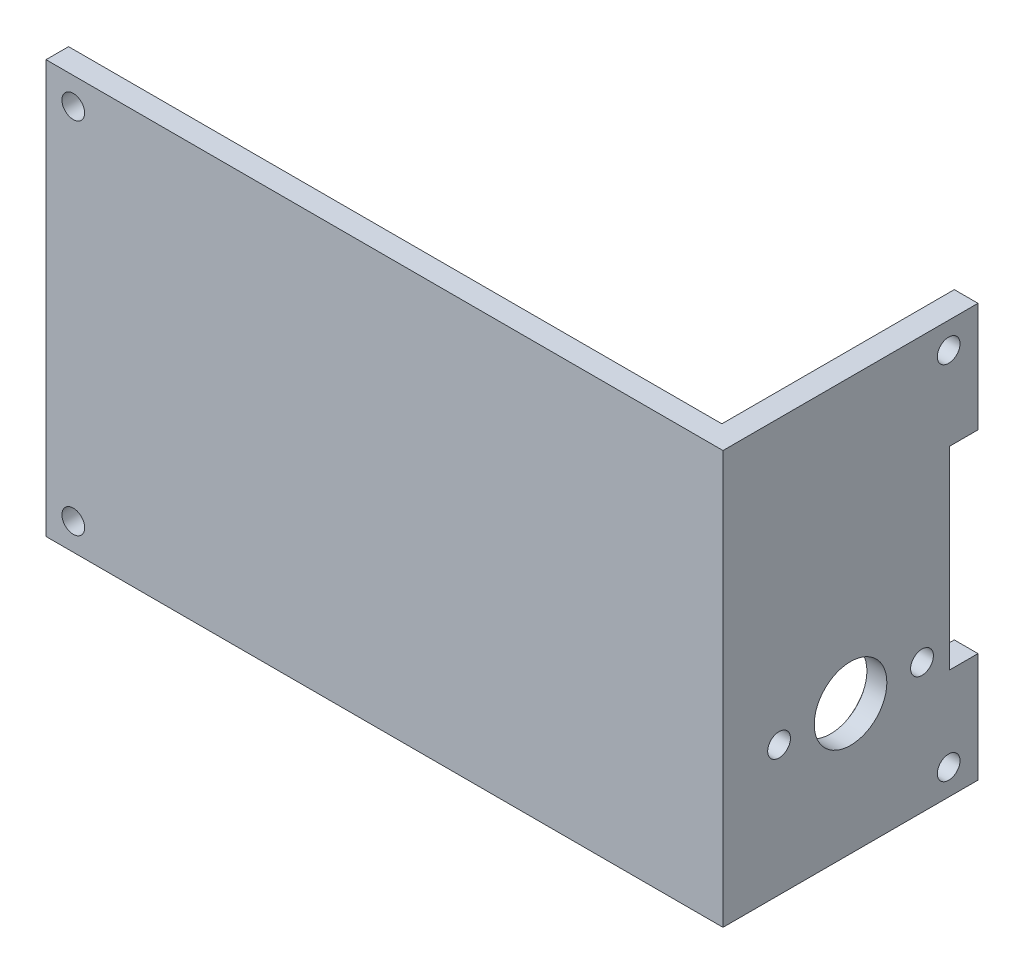
ISO-10303-21;
HEADER;
FILE_DESCRIPTION(('STEP AP214'),'2;1');
FILE_NAME('part.step','',(''),(''),'','','');
FILE_SCHEMA(('AUTOMOTIVE_DESIGN { 1 0 10303 214 1 1 1 1 }'));
ENDSEC;
DATA;
#1=APPLICATION_CONTEXT('core data for automotive mechanical design processes');
#2=APPLICATION_PROTOCOL_DEFINITION('international standard','automotive_design',2000,#1);
#3=PRODUCT_CONTEXT('',#1,'mechanical');
#4=PRODUCT('Part','Part','',(#3));
#5=PRODUCT_RELATED_PRODUCT_CATEGORY('part','',(#4));
#6=PRODUCT_DEFINITION_FORMATION('','',#4);
#7=PRODUCT_DEFINITION_CONTEXT('part definition',#1,'design');
#8=PRODUCT_DEFINITION('design','',#6,#7);
#9=PRODUCT_DEFINITION_SHAPE('','',#8);
#10=(LENGTH_UNIT() NAMED_UNIT(*) SI_UNIT(.MILLI.,.METRE.));
#11=(NAMED_UNIT(*) PLANE_ANGLE_UNIT() SI_UNIT($,.RADIAN.));
#12=(NAMED_UNIT(*) SI_UNIT($,.STERADIAN.) SOLID_ANGLE_UNIT());
#13=UNCERTAINTY_MEASURE_WITH_UNIT(LENGTH_MEASURE(1.E-05),#10,'distance_accuracy_value','');
#14=(GEOMETRIC_REPRESENTATION_CONTEXT(3) GLOBAL_UNCERTAINTY_ASSIGNED_CONTEXT((#13)) GLOBAL_UNIT_ASSIGNED_CONTEXT((#10,
#11,#12)) REPRESENTATION_CONTEXT('',''));
#15=CARTESIAN_POINT('',(0.,0.,0.));
#16=DIRECTION('',(0.,0.,1.));
#17=DIRECTION('',(1.,0.,0.));
#18=AXIS2_PLACEMENT_3D('',#15,#16,#17);
#19=CARTESIAN_POINT('',(86.85,54.9,-30.9));
#20=DIRECTION('',(0.,0.,1.));
#21=DIRECTION('',(1.,0.,0.));
#22=AXIS2_PLACEMENT_3D('',#19,#20,#21);
#23=PLANE('',#22);
#24=DIRECTION('',(0.,-1.,0.));
#25=VECTOR('',#24,1.);
#26=CARTESIAN_POINT('',(86.85,54.9,-30.9));
#27=LINE('',#26,#25);
#28=CARTESIAN_POINT('',(86.85,14.57225898,-30.9));
#29=VERTEX_POINT('',#28);
#30=CARTESIAN_POINT('',(86.85,0.,-30.9));
#31=VERTEX_POINT('',#30);
#32=EDGE_CURVE('E125',#29,#31,#27,.T.);
#33=ORIENTED_EDGE('',*,*,#32,.F.);
#34=DIRECTION('',(1.,0.,0.));
#35=VECTOR('',#34,1.);
#36=CARTESIAN_POINT('',(60.8158620416222,14.57225898,-30.9));
#37=LINE('',#36,#35);
#38=CARTESIAN_POINT('',(90.,14.57225898,-30.9));
#39=VERTEX_POINT('',#38);
#40=EDGE_CURVE('E170',#29,#39,#37,.T.);
#41=ORIENTED_EDGE('',*,*,#40,.T.);
#42=DIRECTION('',(0.,-1.,0.));
#43=VECTOR('',#42,1.);
#44=CARTESIAN_POINT('',(90.,54.9,-30.9));
#45=LINE('',#44,#43);
#46=CARTESIAN_POINT('',(90.,0.,-30.9));
#47=VERTEX_POINT('',#46);
#48=EDGE_CURVE('E124',#39,#47,#45,.T.);
#49=ORIENTED_EDGE('',*,*,#48,.T.);
#50=DIRECTION('',(-1.,0.,0.));
#51=VECTOR('',#50,1.);
#52=CARTESIAN_POINT('',(86.85,0.,-30.9));
#53=LINE('',#52,#51);
#54=EDGE_CURVE('E144',#47,#31,#53,.T.);
#55=ORIENTED_EDGE('',*,*,#54,.T.);
#56=EDGE_LOOP('',(#33,#41,#49,#55));
#57=FACE_BOUND('',#56,.T.);
#58=ADVANCED_FACE('F33',(#57),#23,.F.);
#59=CARTESIAN_POINT('',(73.2000106959749,17.3,-13.95544469));
#60=DIRECTION('',(1.,0.,0.));
#61=DIRECTION('',(0.,0.,-1.));
#62=AXIS2_PLACEMENT_3D('',#59,#60,#61);
#63=CYLINDRICAL_SURFACE('',#62,4.826);
#64=CARTESIAN_POINT('',(90.,17.3,-13.95544469));
#65=DIRECTION('',(1.,0.,0.));
#66=DIRECTION('',(0.,0.,-1.));
#67=AXIS2_PLACEMENT_3D('',#64,#65,#66);
#68=CIRCLE('',#67,4.826);
#69=CARTESIAN_POINT('',(90.,17.3,-18.78144469));
#70=VERTEX_POINT('',#69);
#71=EDGE_CURVE('E218',#70,#70,#68,.T.);
#72=CARTESIAN_POINT('',(87.35,17.3,-13.95544469));
#73=DIRECTION('',(-1.,0.,0.));
#74=DIRECTION('',(0.,0.,1.));
#75=AXIS2_PLACEMENT_3D('',#72,#73,#74);
#76=CIRCLE('',#75,4.826);
#77=CARTESIAN_POINT('',(87.35,17.3,-18.78144469));
#78=VERTEX_POINT('',#77);
#79=EDGE_CURVE('E37',#78,#78,#76,.F.);
#80=CARTESIAN_POINT('',(90.,17.3,-18.78144469));
#81=CARTESIAN_POINT('',(89.9723958333333,17.3,-18.78144469));
#82=CARTESIAN_POINT('',(89.9447916666666,17.3,-18.78144469));
#83=CARTESIAN_POINT('',(89.8895833333333,17.3,-18.78144469));
#84=CARTESIAN_POINT('',(89.8619791666667,17.3,-18.78144469));
#85=CARTESIAN_POINT('',(89.8067708333333,17.3,-18.78144469));
#86=CARTESIAN_POINT('',(89.7791666666667,17.3,-18.78144469));
#87=CARTESIAN_POINT('',(89.7239583333333,17.3,-18.78144469));
#88=CARTESIAN_POINT('',(89.6963541666667,17.3,-18.78144469));
#89=CARTESIAN_POINT('',(89.6411458333333,17.3,-18.78144469));
#90=CARTESIAN_POINT('',(89.6135416666667,17.3,-18.78144469));
#91=CARTESIAN_POINT('',(89.5583333333333,17.3,-18.78144469));
#92=CARTESIAN_POINT('',(89.5307291666667,17.3,-18.78144469));
#93=CARTESIAN_POINT('',(89.4755208333333,17.3,-18.78144469));
#94=CARTESIAN_POINT('',(89.4479166666667,17.3,-18.78144469));
#95=CARTESIAN_POINT('',(89.3927083333333,17.3,-18.78144469));
#96=CARTESIAN_POINT('',(89.3651041666667,17.3,-18.78144469));
#97=CARTESIAN_POINT('',(89.3098958333333,17.3,-18.78144469));
#98=CARTESIAN_POINT('',(89.2822916666667,17.3,-18.78144469));
#99=CARTESIAN_POINT('',(89.2270833333333,17.3,-18.78144469));
#100=CARTESIAN_POINT('',(89.1994791666666,17.3,-18.78144469));
#101=CARTESIAN_POINT('',(89.1442708333333,17.3,-18.78144469));
#102=CARTESIAN_POINT('',(89.1166666666667,17.3,-18.78144469));
#103=CARTESIAN_POINT('',(89.0614583333333,17.3,-18.78144469));
#104=CARTESIAN_POINT('',(89.0338541666667,17.3,-18.78144469));
#105=CARTESIAN_POINT('',(88.9786458333333,17.3,-18.78144469));
#106=CARTESIAN_POINT('',(88.9510416666667,17.3,-18.78144469));
#107=CARTESIAN_POINT('',(88.8958333333333,17.3,-18.78144469));
#108=CARTESIAN_POINT('',(88.8682291666667,17.3,-18.78144469));
#109=CARTESIAN_POINT('',(88.8130208333333,17.3,-18.78144469));
#110=CARTESIAN_POINT('',(88.7854166666667,17.3,-18.78144469));
#111=CARTESIAN_POINT('',(88.7302083333333,17.3,-18.78144469));
#112=CARTESIAN_POINT('',(88.7026041666667,17.3,-18.78144469));
#113=CARTESIAN_POINT('',(88.6473958333333,17.3,-18.78144469));
#114=CARTESIAN_POINT('',(88.6197916666667,17.3,-18.78144469));
#115=CARTESIAN_POINT('',(88.5645833333333,17.3,-18.78144469));
#116=CARTESIAN_POINT('',(88.5369791666667,17.3,-18.78144469));
#117=CARTESIAN_POINT('',(88.4817708333333,17.3,-18.78144469));
#118=CARTESIAN_POINT('',(88.4541666666667,17.3,-18.78144469));
#119=CARTESIAN_POINT('',(88.3989583333333,17.3,-18.78144469));
#120=CARTESIAN_POINT('',(88.3713541666667,17.3,-18.78144469));
#121=CARTESIAN_POINT('',(88.3161458333333,17.3,-18.78144469));
#122=CARTESIAN_POINT('',(88.2885416666667,17.3,-18.78144469));
#123=CARTESIAN_POINT('',(88.2333333333333,17.3,-18.78144469));
#124=CARTESIAN_POINT('',(88.2057291666667,17.3,-18.78144469));
#125=CARTESIAN_POINT('',(88.1505208333333,17.3,-18.78144469));
#126=CARTESIAN_POINT('',(88.1229166666667,17.3,-18.78144469));
#127=CARTESIAN_POINT('',(88.0677083333333,17.3,-18.78144469));
#128=CARTESIAN_POINT('',(88.0401041666667,17.3,-18.78144469));
#129=CARTESIAN_POINT('',(87.9848958333333,17.3,-18.78144469));
#130=CARTESIAN_POINT('',(87.9572916666667,17.3,-18.78144469));
#131=CARTESIAN_POINT('',(87.9020833333333,17.3,-18.78144469));
#132=CARTESIAN_POINT('',(87.8744791666667,17.3,-18.78144469));
#133=CARTESIAN_POINT('',(87.8192708333333,17.3,-18.78144469));
#134=CARTESIAN_POINT('',(87.7916666666667,17.3,-18.78144469));
#135=CARTESIAN_POINT('',(87.7364583333333,17.3,-18.78144469));
#136=CARTESIAN_POINT('',(87.7088541666667,17.3,-18.78144469));
#137=CARTESIAN_POINT('',(87.6536458333333,17.3,-18.78144469));
#138=CARTESIAN_POINT('',(87.6260416666667,17.3,-18.78144469));
#139=CARTESIAN_POINT('',(87.5708333333333,17.3,-18.78144469));
#140=CARTESIAN_POINT('',(87.5432291666667,17.3,-18.78144469));
#141=CARTESIAN_POINT('',(87.4880208333333,17.3,-18.78144469));
#142=CARTESIAN_POINT('',(87.4604166666667,17.3,-18.78144469));
#143=CARTESIAN_POINT('',(87.4052083333333,17.3,-18.78144469));
#144=CARTESIAN_POINT('',(87.3776041666667,17.3,-18.78144469));
#145=CARTESIAN_POINT('',(87.35,17.3,-18.78144469));
#146=B_SPLINE_CURVE_WITH_KNOTS('',3,(#80,#81,#82,#83,#84,#85,#86,#87,#88,#89,#90,#91,#92,#93,
#94,#95,#96,#97,#98,#99,#100,#101,#102,#103,#104,#105,#106,#107,#108,#109,#110,#111,#112,#113,
#114,#115,#116,#117,#118,#119,#120,#121,#122,#123,#124,#125,#126,#127,#128,#129,#130,#131,#132,
#133,#134,#135,#136,#137,#138,#139,#140,#141,#142,#143,#144,#145),.UNSPECIFIED.,.F.,.F.,(4,2,2,
2,2,2,2,2,2,2,2,2,2,2,2,2,2,2,2,2,2,2,2,2,2,2,2,2,2,2,2,2,4),(0.,0.0828125000000013,
0.165624999999989,0.24843749999999,0.331249999999991,0.414062499999993,0.496874999999994,
0.579687499999995,0.662499999999996,0.745312499999998,0.828124999999999,0.910937499999986,
0.993749999999988,1.07656249999999,1.15937499999999,1.24218749999999,1.32499999999999,
1.40781249999998,1.49062499999998,1.57343749999998,1.65624999999998,1.73906249999999,
1.82187499999999,1.90468749999999,1.98749999999999,2.07031249999999,2.15312499999998,
2.23593749999998,2.31874999999998,2.40156249999998,2.48437499999998,2.56718749999998,
2.64999999999999),.UNSPECIFIED.);
#147=EDGE_CURVE('BSEAM263',#70,#78,#146,.T.);
#148=ORIENTED_EDGE('',*,*,#71,.T.);
#149=ORIENTED_EDGE('',*,*,#79,.F.);
#150=ORIENTED_EDGE('',*,*,#147,.T.);
#151=ORIENTED_EDGE('',*,*,#147,.F.);
#152=EDGE_LOOP('',(#148,#150,#149,#151));
#153=FACE_BOUND('',#152,.T.);
#154=ADVANCED_FACE('F263',(#153),#63,.F.);
#155=CARTESIAN_POINT('',(0.,54.9,3.));
#156=DIRECTION('',(1.,0.,0.));
#157=DIRECTION('',(0.,0.,-1.));
#158=AXIS2_PLACEMENT_3D('',#155,#156,#157);
#159=PLANE('',#158);
#160=DIRECTION('',(0.,0.,1.));
#161=VECTOR('',#160,1.);
#162=CARTESIAN_POINT('',(0.,0.,3.));
#163=LINE('',#162,#161);
#164=CARTESIAN_POINT('',(0.,0.,0.));
#165=VERTEX_POINT('',#164);
#166=CARTESIAN_POINT('',(0.,0.,3.));
#167=VERTEX_POINT('',#166);
#168=EDGE_CURVE('E135',#165,#167,#163,.T.);
#169=ORIENTED_EDGE('',*,*,#168,.T.);
#170=DIRECTION('',(0.,-1.,0.));
#171=VECTOR('',#170,1.);
#172=CARTESIAN_POINT('',(0.,54.9,3.));
#173=LINE('',#172,#171);
#174=CARTESIAN_POINT('',(0.,54.9,3.));
#175=VERTEX_POINT('',#174);
#176=EDGE_CURVE('E11',#175,#167,#173,.T.);
#177=ORIENTED_EDGE('',*,*,#176,.F.);
#178=DIRECTION('',(0.,0.,1.));
#179=VECTOR('',#178,1.);
#180=CARTESIAN_POINT('',(0.,54.9,3.));
#181=LINE('',#180,#179);
#182=CARTESIAN_POINT('',(0.,54.9,0.));
#183=VERTEX_POINT('',#182);
#184=EDGE_CURVE('E150',#183,#175,#181,.T.);
#185=ORIENTED_EDGE('',*,*,#184,.F.);
#186=DIRECTION('',(0.,-1.,0.));
#187=VECTOR('',#186,1.);
#188=CARTESIAN_POINT('',(0.,54.9,0.));
#189=LINE('',#188,#187);
#190=EDGE_CURVE('E131',#183,#165,#189,.T.);
#191=ORIENTED_EDGE('',*,*,#190,.T.);
#192=EDGE_LOOP('',(#169,#177,#185,#191));
#193=FACE_BOUND('',#192,.T.);
#194=ADVANCED_FACE('F35',(#193),#159,.F.);
#195=CARTESIAN_POINT('',(90.,54.9,2.99999999999999));
#196=DIRECTION('',(0.,0.,-1.));
#197=DIRECTION('',(-1.,0.,0.));
#198=AXIS2_PLACEMENT_3D('',#195,#196,#197);
#199=PLANE('',#198);
#200=CARTESIAN_POINT('',(3.625,51.325,3.));
#201=DIRECTION('',(0.,0.,1.));
#202=DIRECTION('',(1.,0.,0.));
#203=AXIS2_PLACEMENT_3D('',#200,#201,#202);
#204=CIRCLE('',#203,1.51);
#205=CARTESIAN_POINT('',(5.135,51.325,3.));
#206=VERTEX_POINT('',#205);
#207=EDGE_CURVE('E227',#206,#206,#204,.T.);
#208=ORIENTED_EDGE('',*,*,#207,.F.);
#209=EDGE_LOOP('',(#208));
#210=FACE_BOUND('',#209,.T.);
#211=CARTESIAN_POINT('',(3.625,3.575,3.));
#212=DIRECTION('',(0.,0.,1.));
#213=DIRECTION('',(1.,0.,0.));
#214=AXIS2_PLACEMENT_3D('',#211,#212,#213);
#215=CIRCLE('',#214,1.51);
#216=CARTESIAN_POINT('',(5.135,3.575,3.));
#217=VERTEX_POINT('',#216);
#218=EDGE_CURVE('E226',#217,#217,#215,.T.);
#219=ORIENTED_EDGE('',*,*,#218,.F.);
#220=EDGE_LOOP('',(#219));
#221=FACE_BOUND('',#220,.T.);
#222=DIRECTION('',(1.,0.,0.));
#223=VECTOR('',#222,1.);
#224=CARTESIAN_POINT('',(90.,0.,2.99999999999999));
#225=LINE('',#224,#223);
#226=CARTESIAN_POINT('',(90.,0.,2.99999999999999));
#227=VERTEX_POINT('',#226);
#228=EDGE_CURVE('E138',#167,#227,#225,.T.);
#229=ORIENTED_EDGE('',*,*,#228,.T.);
#230=DIRECTION('',(0.,-1.,0.));
#231=VECTOR('',#230,1.);
#232=CARTESIAN_POINT('',(90.,54.9,2.99999999999999));
#233=LINE('',#232,#231);
#234=CARTESIAN_POINT('',(90.,54.9,2.99999999999999));
#235=VERTEX_POINT('',#234);
#236=EDGE_CURVE('E42',#235,#227,#233,.T.);
#237=ORIENTED_EDGE('',*,*,#236,.F.);
#238=DIRECTION('',(1.,0.,0.));
#239=VECTOR('',#238,1.);
#240=CARTESIAN_POINT('',(90.,54.9,2.99999999999999));
#241=LINE('',#240,#239);
#242=EDGE_CURVE('E93',#175,#235,#241,.T.);
#243=ORIENTED_EDGE('',*,*,#242,.F.);
#244=ORIENTED_EDGE('',*,*,#176,.T.);
#245=EDGE_LOOP('',(#229,#237,#243,#244));
#246=FACE_BOUND('',#245,.T.);
#247=ADVANCED_FACE('F253',(#210,#221,#246),#199,.F.);
#248=CARTESIAN_POINT('',(90.,54.9,-30.9));
#249=DIRECTION('',(-1.,0.,0.));
#250=DIRECTION('',(0.,0.,1.));
#251=AXIS2_PLACEMENT_3D('',#248,#249,#250);
#252=PLANE('',#251);
#253=CARTESIAN_POINT('',(90.,17.3,-4.45544469000001));
#254=DIRECTION('',(1.,0.,0.));
#255=DIRECTION('',(0.,0.,-1.));
#256=AXIS2_PLACEMENT_3D('',#253,#254,#255);
#257=CIRCLE('',#256,1.515);
#258=CARTESIAN_POINT('',(90.,17.3,-5.97044469000001));
#259=VERTEX_POINT('',#258);
#260=EDGE_CURVE('E219',#259,#259,#257,.T.);
#261=ORIENTED_EDGE('',*,*,#260,.F.);
#262=EDGE_LOOP('',(#261));
#263=FACE_BOUND('',#262,.T.);
#264=CARTESIAN_POINT('',(90.,17.3,-23.45544469));
#265=DIRECTION('',(1.,0.,0.));
#266=DIRECTION('',(0.,0.,-1.));
#267=AXIS2_PLACEMENT_3D('',#264,#265,#266);
#268=CIRCLE('',#267,1.515);
#269=CARTESIAN_POINT('',(90.,17.3,-24.97044469));
#270=VERTEX_POINT('',#269);
#271=EDGE_CURVE('E211',#270,#270,#268,.T.);
#272=ORIENTED_EDGE('',*,*,#271,.F.);
#273=EDGE_LOOP('',(#272));
#274=FACE_BOUND('',#273,.T.);
#275=ORIENTED_EDGE('',*,*,#71,.F.);
#276=EDGE_LOOP('',(#275));
#277=FACE_BOUND('',#276,.T.);
#278=CARTESIAN_POINT('',(90.,51.45,-27.));
#279=DIRECTION('',(1.,0.,0.));
#280=DIRECTION('',(0.,0.,-1.));
#281=AXIS2_PLACEMENT_3D('',#278,#279,#280);
#282=CIRCLE('',#281,1.51);
#283=CARTESIAN_POINT('',(90.,51.45,-28.51));
#284=VERTEX_POINT('',#283);
#285=EDGE_CURVE('E239',#284,#284,#282,.T.);
#286=ORIENTED_EDGE('',*,*,#285,.F.);
#287=EDGE_LOOP('',(#286));
#288=FACE_BOUND('',#287,.T.);
#289=CARTESIAN_POINT('',(90.,3.45,-27.));
#290=DIRECTION('',(1.,0.,0.));
#291=DIRECTION('',(0.,0.,-1.));
#292=AXIS2_PLACEMENT_3D('',#289,#290,#291);
#293=CIRCLE('',#292,1.51);
#294=CARTESIAN_POINT('',(90.,3.45,-28.51));
#295=VERTEX_POINT('',#294);
#296=EDGE_CURVE('E234',#295,#295,#293,.T.);
#297=ORIENTED_EDGE('',*,*,#296,.F.);
#298=EDGE_LOOP('',(#297));
#299=FACE_BOUND('',#298,.T.);
#300=ORIENTED_EDGE('',*,*,#48,.F.);
#301=DIRECTION('',(0.,0.,-1.));
#302=VECTOR('',#301,1.);
#303=CARTESIAN_POINT('',(90.,14.57225898,-30.9));
#304=LINE('',#303,#302);
#305=CARTESIAN_POINT('',(90.,14.57225898,-27.101120675372));
#306=VERTEX_POINT('',#305);
#307=EDGE_CURVE('E175',#306,#39,#304,.T.);
#308=ORIENTED_EDGE('',*,*,#307,.F.);
#309=DIRECTION('',(0.,-1.,0.));
#310=VECTOR('',#309,1.);
#311=CARTESIAN_POINT('',(90.,14.57225898,-27.101120675372));
#312=LINE('',#311,#310);
#313=CARTESIAN_POINT('',(90.,40.32774102,-27.101120675372));
#314=VERTEX_POINT('',#313);
#315=EDGE_CURVE('E199',#314,#306,#312,.T.);
#316=ORIENTED_EDGE('',*,*,#315,.F.);
#317=DIRECTION('',(0.,0.,1.));
#318=VECTOR('',#317,1.);
#319=CARTESIAN_POINT('',(90.,40.32774102,-30.9));
#320=LINE('',#319,#318);
#321=CARTESIAN_POINT('',(90.,40.32774102,-30.9));
#322=VERTEX_POINT('',#321);
#323=EDGE_CURVE('E197',#322,#314,#320,.T.);
#324=ORIENTED_EDGE('',*,*,#323,.F.);
#325=CARTESIAN_POINT('',(90.,54.9,-30.9));
#326=VERTEX_POINT('',#325);
#327=EDGE_CURVE('E153',#326,#322,#45,.T.);
#328=ORIENTED_EDGE('',*,*,#327,.F.);
#329=DIRECTION('',(0.,0.,-1.));
#330=VECTOR('',#329,1.);
#331=CARTESIAN_POINT('',(90.,54.9,-30.9));
#332=LINE('',#331,#330);
#333=EDGE_CURVE('E110',#235,#326,#332,.T.);
#334=ORIENTED_EDGE('',*,*,#333,.F.);
#335=ORIENTED_EDGE('',*,*,#236,.T.);
#336=DIRECTION('',(0.,0.,-1.));
#337=VECTOR('',#336,1.);
#338=CARTESIAN_POINT('',(90.,0.,-30.9));
#339=LINE('',#338,#337);
#340=EDGE_CURVE('E141',#227,#47,#339,.T.);
#341=ORIENTED_EDGE('',*,*,#340,.T.);
#342=EDGE_LOOP('',(#300,#308,#316,#324,#328,#334,#335,#341));
#343=FACE_BOUND('',#342,.T.);
#344=ADVANCED_FACE('F159',(#263,#274,#277,#288,#299,#343),#252,.F.);
#345=ORIENTED_EDGE('',*,*,#327,.T.);
#346=DIRECTION('',(1.,0.,0.));
#347=VECTOR('',#346,1.);
#348=CARTESIAN_POINT('',(60.8158620416222,40.32774102,-30.9));
#349=LINE('',#348,#347);
#350=CARTESIAN_POINT('',(86.85,40.32774102,-30.9));
#351=VERTEX_POINT('',#350);
#352=EDGE_CURVE('E121',#351,#322,#349,.T.);
#353=ORIENTED_EDGE('',*,*,#352,.F.);
#354=CARTESIAN_POINT('',(86.85,54.9,-30.9));
#355=VERTEX_POINT('',#354);
#356=EDGE_CURVE('E117',#355,#351,#27,.T.);
#357=ORIENTED_EDGE('',*,*,#356,.F.);
#358=DIRECTION('',(-1.,0.,0.));
#359=VECTOR('',#358,1.);
#360=CARTESIAN_POINT('',(86.85,54.9,-30.9));
#361=LINE('',#360,#359);
#362=EDGE_CURVE('E103',#326,#355,#361,.T.);
#363=ORIENTED_EDGE('',*,*,#362,.F.);
#364=EDGE_LOOP('',(#345,#353,#357,#363));
#365=FACE_BOUND('',#364,.T.);
#366=ADVANCED_FACE('F118',(#365),#23,.F.);
#367=CARTESIAN_POINT('',(86.85,54.9,0.));
#368=DIRECTION('',(1.,0.,0.));
#369=DIRECTION('',(0.,0.,-1.));
#370=AXIS2_PLACEMENT_3D('',#367,#368,#369);
#371=PLANE('',#370);
#372=CARTESIAN_POINT('',(86.85,17.3,-13.95544469));
#373=DIRECTION('',(-1.,0.,0.));
#374=DIRECTION('',(0.,0.,1.));
#375=AXIS2_PLACEMENT_3D('',#372,#373,#374);
#376=CIRCLE('',#375,5.5);
#377=CARTESIAN_POINT('',(86.85,17.3,-8.45544469000001));
#378=VERTEX_POINT('',#377);
#379=EDGE_CURVE('E193',#378,#378,#376,.T.);
#380=ORIENTED_EDGE('',*,*,#379,.F.);
#381=EDGE_LOOP('',(#380));
#382=FACE_BOUND('',#381,.T.);
#383=CARTESIAN_POINT('',(86.85,17.3,-4.45544469000001));
#384=DIRECTION('',(1.,0.,0.));
#385=DIRECTION('',(0.,0.,-1.));
#386=AXIS2_PLACEMENT_3D('',#383,#384,#385);
#387=CIRCLE('',#386,1.515);
#388=CARTESIAN_POINT('',(86.85,17.3,-5.97044469000001));
#389=VERTEX_POINT('',#388);
#390=EDGE_CURVE('E215',#389,#389,#387,.F.);
#391=ORIENTED_EDGE('',*,*,#390,.F.);
#392=EDGE_LOOP('',(#391));
#393=FACE_BOUND('',#392,.T.);
#394=CARTESIAN_POINT('',(86.85,17.3,-23.45544469));
#395=DIRECTION('',(1.,0.,0.));
#396=DIRECTION('',(0.,0.,-1.));
#397=AXIS2_PLACEMENT_3D('',#394,#395,#396);
#398=CIRCLE('',#397,1.515);
#399=CARTESIAN_POINT('',(86.85,17.3,-24.97044469));
#400=VERTEX_POINT('',#399);
#401=EDGE_CURVE('E214',#400,#400,#398,.F.);
#402=ORIENTED_EDGE('',*,*,#401,.F.);
#403=EDGE_LOOP('',(#402));
#404=FACE_BOUND('',#403,.T.);
#405=CARTESIAN_POINT('',(86.85,51.45,-27.));
#406=DIRECTION('',(1.,0.,0.));
#407=DIRECTION('',(0.,0.,-1.));
#408=AXIS2_PLACEMENT_3D('',#405,#406,#407);
#409=CIRCLE('',#408,1.51);
#410=CARTESIAN_POINT('',(86.85,51.45,-28.51));
#411=VERTEX_POINT('',#410);
#412=EDGE_CURVE('E139',#411,#411,#409,.F.);
#413=ORIENTED_EDGE('',*,*,#412,.F.);
#414=EDGE_LOOP('',(#413));
#415=FACE_BOUND('',#414,.T.);
#416=CARTESIAN_POINT('',(86.85,3.45,-27.));
#417=DIRECTION('',(1.,0.,0.));
#418=DIRECTION('',(0.,0.,-1.));
#419=AXIS2_PLACEMENT_3D('',#416,#417,#418);
#420=CIRCLE('',#419,1.51);
#421=CARTESIAN_POINT('',(86.85,3.45,-28.51));
#422=VERTEX_POINT('',#421);
#423=EDGE_CURVE('E242',#422,#422,#420,.F.);
#424=ORIENTED_EDGE('',*,*,#423,.F.);
#425=EDGE_LOOP('',(#424));
#426=FACE_BOUND('',#425,.T.);
#427=DIRECTION('',(0.,1.,0.));
#428=VECTOR('',#427,1.);
#429=CARTESIAN_POINT('',(86.85,14.57225898,-27.101120675372));
#430=LINE('',#429,#428);
#431=CARTESIAN_POINT('',(86.85,14.57225898,-27.101120675372));
#432=VERTEX_POINT('',#431);
#433=CARTESIAN_POINT('',(86.85,40.32774102,-27.101120675372));
#434=VERTEX_POINT('',#433);
#435=EDGE_CURVE('E188',#432,#434,#430,.T.);
#436=ORIENTED_EDGE('',*,*,#435,.F.);
#437=DIRECTION('',(0.,0.,1.));
#438=VECTOR('',#437,1.);
#439=CARTESIAN_POINT('',(86.85,14.57225898,-30.9));
#440=LINE('',#439,#438);
#441=EDGE_CURVE('E185',#29,#432,#440,.T.);
#442=ORIENTED_EDGE('',*,*,#441,.F.);
#443=ORIENTED_EDGE('',*,*,#32,.T.);
#444=DIRECTION('',(0.,0.,1.));
#445=VECTOR('',#444,1.);
#446=CARTESIAN_POINT('',(86.85,0.,0.));
#447=LINE('',#446,#445);
#448=CARTESIAN_POINT('',(86.85,0.,0.));
#449=VERTEX_POINT('',#448);
#450=EDGE_CURVE('E147',#31,#449,#447,.T.);
#451=ORIENTED_EDGE('',*,*,#450,.T.);
#452=DIRECTION('',(0.,-1.,0.));
#453=VECTOR('',#452,1.);
#454=CARTESIAN_POINT('',(86.85,54.9,0.));
#455=LINE('',#454,#453);
#456=CARTESIAN_POINT('',(86.85,54.9,0.));
#457=VERTEX_POINT('',#456);
#458=EDGE_CURVE('E129',#457,#449,#455,.T.);
#459=ORIENTED_EDGE('',*,*,#458,.F.);
#460=DIRECTION('',(0.,0.,1.));
#461=VECTOR('',#460,1.);
#462=CARTESIAN_POINT('',(86.85,54.9,0.));
#463=LINE('',#462,#461);
#464=EDGE_CURVE('E107',#355,#457,#463,.T.);
#465=ORIENTED_EDGE('',*,*,#464,.F.);
#466=ORIENTED_EDGE('',*,*,#356,.T.);
#467=DIRECTION('',(0.,0.,-1.));
#468=VECTOR('',#467,1.);
#469=CARTESIAN_POINT('',(86.85,40.32774102,-30.9));
#470=LINE('',#469,#468);
#471=EDGE_CURVE('E191',#434,#351,#470,.T.);
#472=ORIENTED_EDGE('',*,*,#471,.F.);
#473=EDGE_LOOP('',(#436,#442,#443,#451,#459,#465,#466,#472));
#474=FACE_BOUND('',#473,.T.);
#475=ADVANCED_FACE('F128',(#382,#393,#404,#415,#426,#474),#371,.F.);
#476=CARTESIAN_POINT('',(0.,54.9,0.));
#477=DIRECTION('',(0.,0.,1.));
#478=DIRECTION('',(1.,0.,0.));
#479=AXIS2_PLACEMENT_3D('',#476,#477,#478);
#480=PLANE('',#479);
#481=CARTESIAN_POINT('',(3.625,51.325,0.));
#482=DIRECTION('',(0.,0.,1.));
#483=DIRECTION('',(1.,0.,0.));
#484=AXIS2_PLACEMENT_3D('',#481,#482,#483);
#485=CIRCLE('',#484,1.51);
#486=CARTESIAN_POINT('',(5.135,51.325,0.));
#487=VERTEX_POINT('',#486);
#488=EDGE_CURVE('E230',#487,#487,#485,.F.);
#489=ORIENTED_EDGE('',*,*,#488,.F.);
#490=EDGE_LOOP('',(#489));
#491=FACE_BOUND('',#490,.T.);
#492=CARTESIAN_POINT('',(3.625,3.575,0.));
#493=DIRECTION('',(0.,0.,1.));
#494=DIRECTION('',(1.,0.,0.));
#495=AXIS2_PLACEMENT_3D('',#492,#493,#494);
#496=CIRCLE('',#495,1.51);
#497=CARTESIAN_POINT('',(5.135,3.575,0.));
#498=VERTEX_POINT('',#497);
#499=EDGE_CURVE('E231',#498,#498,#496,.F.);
#500=ORIENTED_EDGE('',*,*,#499,.F.);
#501=EDGE_LOOP('',(#500));
#502=FACE_BOUND('',#501,.T.);
#503=DIRECTION('',(-1.,0.,0.));
#504=VECTOR('',#503,1.);
#505=CARTESIAN_POINT('',(0.,0.,0.));
#506=LINE('',#505,#504);
#507=EDGE_CURVE('E85',#449,#165,#506,.T.);
#508=ORIENTED_EDGE('',*,*,#507,.T.);
#509=ORIENTED_EDGE('',*,*,#190,.F.);
#510=DIRECTION('',(-1.,0.,0.));
#511=VECTOR('',#510,1.);
#512=CARTESIAN_POINT('',(0.,54.9,0.));
#513=LINE('',#512,#511);
#514=EDGE_CURVE('E58',#457,#183,#513,.T.);
#515=ORIENTED_EDGE('',*,*,#514,.F.);
#516=ORIENTED_EDGE('',*,*,#458,.T.);
#517=EDGE_LOOP('',(#508,#509,#515,#516));
#518=FACE_BOUND('',#517,.T.);
#519=ADVANCED_FACE('F279',(#491,#502,#518),#480,.F.);
#520=CARTESIAN_POINT('',(0.,54.9,0.));
#521=DIRECTION('',(0.,-1.,0.));
#522=DIRECTION('',(0.,0.,-1.));
#523=AXIS2_PLACEMENT_3D('',#520,#521,#522);
#524=PLANE('',#523);
#525=ORIENTED_EDGE('',*,*,#184,.T.);
#526=ORIENTED_EDGE('',*,*,#242,.T.);
#527=ORIENTED_EDGE('',*,*,#333,.T.);
#528=ORIENTED_EDGE('',*,*,#362,.T.);
#529=ORIENTED_EDGE('',*,*,#464,.T.);
#530=ORIENTED_EDGE('',*,*,#514,.T.);
#531=EDGE_LOOP('',(#525,#526,#527,#528,#529,#530));
#532=FACE_BOUND('',#531,.T.);
#533=ADVANCED_FACE('F105',(#532),#524,.F.);
#534=CARTESIAN_POINT('',(0.,0.,0.));
#535=DIRECTION('',(0.,-1.,0.));
#536=DIRECTION('',(0.,0.,-1.));
#537=AXIS2_PLACEMENT_3D('',#534,#535,#536);
#538=PLANE('',#537);
#539=ORIENTED_EDGE('',*,*,#168,.F.);
#540=ORIENTED_EDGE('',*,*,#507,.F.);
#541=ORIENTED_EDGE('',*,*,#450,.F.);
#542=ORIENTED_EDGE('',*,*,#54,.F.);
#543=ORIENTED_EDGE('',*,*,#340,.F.);
#544=ORIENTED_EDGE('',*,*,#228,.F.);
#545=EDGE_LOOP('',(#539,#540,#541,#542,#543,#544));
#546=FACE_BOUND('',#545,.T.);
#547=ADVANCED_FACE('F163',(#546),#538,.T.);
#548=CARTESIAN_POINT('',(82.5790750416332,3.45,-27.));
#549=DIRECTION('',(1.,0.,0.));
#550=DIRECTION('',(0.,0.,-1.));
#551=AXIS2_PLACEMENT_3D('',#548,#549,#550);
#552=CYLINDRICAL_SURFACE('',#551,1.51);
#553=ORIENTED_EDGE('',*,*,#423,.T.);
#554=EDGE_LOOP('',(#553));
#555=FACE_BOUND('',#554,.T.);
#556=ORIENTED_EDGE('',*,*,#296,.T.);
#557=EDGE_LOOP('',(#556));
#558=FACE_BOUND('',#557,.T.);
#559=ADVANCED_FACE('F292',(#555,#558),#552,.F.);
#560=CARTESIAN_POINT('',(82.5790750416332,51.45,-27.));
#561=DIRECTION('',(1.,0.,0.));
#562=DIRECTION('',(0.,0.,-1.));
#563=AXIS2_PLACEMENT_3D('',#560,#561,#562);
#564=CYLINDRICAL_SURFACE('',#563,1.51);
#565=ORIENTED_EDGE('',*,*,#412,.T.);
#566=EDGE_LOOP('',(#565));
#567=FACE_BOUND('',#566,.T.);
#568=ORIENTED_EDGE('',*,*,#285,.T.);
#569=EDGE_LOOP('',(#568));
#570=FACE_BOUND('',#569,.T.);
#571=ADVANCED_FACE('F297',(#567,#570),#564,.F.);
#572=CARTESIAN_POINT('',(3.625,3.575,-4.27092495836675));
#573=DIRECTION('',(0.,0.,1.));
#574=DIRECTION('',(1.,0.,0.));
#575=AXIS2_PLACEMENT_3D('',#572,#573,#574);
#576=CYLINDRICAL_SURFACE('',#575,1.51);
#577=CARTESIAN_POINT('',(5.135,3.575,0.));
#578=CARTESIAN_POINT('',(5.135,3.575,0.0312499999999992));
#579=CARTESIAN_POINT('',(5.135,3.575,0.0624999999999992));
#580=CARTESIAN_POINT('',(5.135,3.575,0.124999999999999));
#581=CARTESIAN_POINT('',(5.135,3.575,0.156249999999999));
#582=CARTESIAN_POINT('',(5.135,3.575,0.218749999999999));
#583=CARTESIAN_POINT('',(5.135,3.575,0.249999999999999));
#584=CARTESIAN_POINT('',(5.135,3.575,0.312499999999999));
#585=CARTESIAN_POINT('',(5.135,3.575,0.343749999999999));
#586=CARTESIAN_POINT('',(5.135,3.575,0.40625));
#587=CARTESIAN_POINT('',(5.135,3.575,0.4375));
#588=CARTESIAN_POINT('',(5.135,3.575,0.5));
#589=CARTESIAN_POINT('',(5.135,3.575,0.53125));
#590=CARTESIAN_POINT('',(5.135,3.575,0.59375));
#591=CARTESIAN_POINT('',(5.135,3.575,0.625));
#592=CARTESIAN_POINT('',(5.135,3.575,0.6875));
#593=CARTESIAN_POINT('',(5.135,3.575,0.71875));
#594=CARTESIAN_POINT('',(5.135,3.575,0.78125));
#595=CARTESIAN_POINT('',(5.135,3.575,0.8125));
#596=CARTESIAN_POINT('',(5.135,3.575,0.875));
#597=CARTESIAN_POINT('',(5.135,3.575,0.906249999999999));
#598=CARTESIAN_POINT('',(5.135,3.575,0.968749999999999));
#599=CARTESIAN_POINT('',(5.135,3.575,0.999999999999999));
#600=CARTESIAN_POINT('',(5.135,3.575,1.0625));
#601=CARTESIAN_POINT('',(5.135,3.575,1.09375));
#602=CARTESIAN_POINT('',(5.135,3.575,1.15625));
#603=CARTESIAN_POINT('',(5.135,3.575,1.1875));
#604=CARTESIAN_POINT('',(5.135,3.575,1.25));
#605=CARTESIAN_POINT('',(5.135,3.575,1.28125));
#606=CARTESIAN_POINT('',(5.135,3.575,1.34375));
#607=CARTESIAN_POINT('',(5.135,3.575,1.375));
#608=CARTESIAN_POINT('',(5.135,3.575,1.4375));
#609=CARTESIAN_POINT('',(5.135,3.575,1.46875));
#610=CARTESIAN_POINT('',(5.135,3.575,1.53125));
#611=CARTESIAN_POINT('',(5.135,3.575,1.5625));
#612=CARTESIAN_POINT('',(5.135,3.575,1.625));
#613=CARTESIAN_POINT('',(5.135,3.575,1.65625));
#614=CARTESIAN_POINT('',(5.135,3.575,1.71875));
#615=CARTESIAN_POINT('',(5.135,3.575,1.75));
#616=CARTESIAN_POINT('',(5.135,3.575,1.8125));
#617=CARTESIAN_POINT('',(5.135,3.575,1.84375));
#618=CARTESIAN_POINT('',(5.135,3.575,1.90625));
#619=CARTESIAN_POINT('',(5.135,3.575,1.9375));
#620=CARTESIAN_POINT('',(5.135,3.575,2.));
#621=CARTESIAN_POINT('',(5.135,3.575,2.03125));
#622=CARTESIAN_POINT('',(5.135,3.575,2.09375));
#623=CARTESIAN_POINT('',(5.135,3.575,2.125));
#624=CARTESIAN_POINT('',(5.135,3.575,2.1875));
#625=CARTESIAN_POINT('',(5.135,3.575,2.21875));
#626=CARTESIAN_POINT('',(5.135,3.575,2.28125));
#627=CARTESIAN_POINT('',(5.135,3.575,2.3125));
#628=CARTESIAN_POINT('',(5.135,3.575,2.375));
#629=CARTESIAN_POINT('',(5.135,3.575,2.40625));
#630=CARTESIAN_POINT('',(5.135,3.575,2.46875));
#631=CARTESIAN_POINT('',(5.135,3.575,2.5));
#632=CARTESIAN_POINT('',(5.135,3.575,2.5625));
#633=CARTESIAN_POINT('',(5.135,3.575,2.59375));
#634=CARTESIAN_POINT('',(5.135,3.575,2.65625));
#635=CARTESIAN_POINT('',(5.135,3.575,2.6875));
#636=CARTESIAN_POINT('',(5.135,3.575,2.75));
#637=CARTESIAN_POINT('',(5.135,3.575,2.78125));
#638=CARTESIAN_POINT('',(5.135,3.575,2.84375));
#639=CARTESIAN_POINT('',(5.135,3.575,2.875));
#640=CARTESIAN_POINT('',(5.135,3.575,2.9375));
#641=CARTESIAN_POINT('',(5.135,3.575,2.96875));
#642=CARTESIAN_POINT('',(5.135,3.575,3.));
#643=B_SPLINE_CURVE_WITH_KNOTS('',3,(#577,#578,#579,#580,#581,#582,#583,#584,#585,#586,#587,
#588,#589,#590,#591,#592,#593,#594,#595,#596,#597,#598,#599,#600,#601,#602,#603,#604,#605,#606,
#607,#608,#609,#610,#611,#612,#613,#614,#615,#616,#617,#618,#619,#620,#621,#622,#623,#624,#625,
#626,#627,#628,#629,#630,#631,#632,#633,#634,#635,#636,#637,#638,#639,#640,#641,#642),
.UNSPECIFIED.,.F.,.F.,(4,2,2,2,2,2,2,2,2,2,2,2,2,2,2,2,2,2,2,2,2,2,2,2,2,2,2,2,2,2,2,2,4),(0.,
0.0937500000000001,0.1875,0.28125,0.375,0.46875,0.5625,0.656250000000001,0.750000000000001,
0.843750000000001,0.9375,1.03125,1.125,1.21875,1.3125,1.40625,1.5,1.59375,1.6875,1.78125,1.875,
1.96875,2.0625,2.15625,2.25,2.34375,2.4375,2.53125,2.625,2.71875,2.8125,2.90625,3.),.UNSPECIFIED.);
#644=EDGE_CURVE('BSEAM301',#498,#217,#643,.T.);
#645=ORIENTED_EDGE('',*,*,#499,.T.);
#646=ORIENTED_EDGE('',*,*,#218,.T.);
#647=ORIENTED_EDGE('',*,*,#644,.T.);
#648=ORIENTED_EDGE('',*,*,#644,.F.);
#649=EDGE_LOOP('',(#645,#647,#646,#648));
#650=FACE_BOUND('',#649,.T.);
#651=ADVANCED_FACE('F301',(#650),#576,.F.);
#652=CARTESIAN_POINT('',(3.625,51.325,-4.27092495836675));
#653=DIRECTION('',(0.,0.,1.));
#654=DIRECTION('',(1.,0.,0.));
#655=AXIS2_PLACEMENT_3D('',#652,#653,#654);
#656=CYLINDRICAL_SURFACE('',#655,1.51);
#657=CARTESIAN_POINT('',(5.135,51.325,0.));
#658=CARTESIAN_POINT('',(5.135,51.325,0.0312499999999992));
#659=CARTESIAN_POINT('',(5.135,51.325,0.0624999999999992));
#660=CARTESIAN_POINT('',(5.135,51.325,0.124999999999999));
#661=CARTESIAN_POINT('',(5.135,51.325,0.156249999999999));
#662=CARTESIAN_POINT('',(5.135,51.325,0.218749999999999));
#663=CARTESIAN_POINT('',(5.135,51.325,0.249999999999999));
#664=CARTESIAN_POINT('',(5.135,51.325,0.312499999999999));
#665=CARTESIAN_POINT('',(5.135,51.325,0.343749999999999));
#666=CARTESIAN_POINT('',(5.135,51.325,0.40625));
#667=CARTESIAN_POINT('',(5.135,51.325,0.4375));
#668=CARTESIAN_POINT('',(5.135,51.325,0.5));
#669=CARTESIAN_POINT('',(5.135,51.325,0.53125));
#670=CARTESIAN_POINT('',(5.135,51.325,0.59375));
#671=CARTESIAN_POINT('',(5.135,51.325,0.625));
#672=CARTESIAN_POINT('',(5.135,51.325,0.6875));
#673=CARTESIAN_POINT('',(5.135,51.325,0.71875));
#674=CARTESIAN_POINT('',(5.135,51.325,0.78125));
#675=CARTESIAN_POINT('',(5.135,51.325,0.8125));
#676=CARTESIAN_POINT('',(5.135,51.325,0.875));
#677=CARTESIAN_POINT('',(5.135,51.325,0.906249999999999));
#678=CARTESIAN_POINT('',(5.135,51.325,0.968749999999999));
#679=CARTESIAN_POINT('',(5.135,51.325,0.999999999999999));
#680=CARTESIAN_POINT('',(5.135,51.325,1.0625));
#681=CARTESIAN_POINT('',(5.135,51.325,1.09375));
#682=CARTESIAN_POINT('',(5.135,51.325,1.15625));
#683=CARTESIAN_POINT('',(5.135,51.325,1.1875));
#684=CARTESIAN_POINT('',(5.135,51.325,1.25));
#685=CARTESIAN_POINT('',(5.135,51.325,1.28125));
#686=CARTESIAN_POINT('',(5.135,51.325,1.34375));
#687=CARTESIAN_POINT('',(5.135,51.325,1.375));
#688=CARTESIAN_POINT('',(5.135,51.325,1.4375));
#689=CARTESIAN_POINT('',(5.135,51.325,1.46875));
#690=CARTESIAN_POINT('',(5.135,51.325,1.53125));
#691=CARTESIAN_POINT('',(5.135,51.325,1.5625));
#692=CARTESIAN_POINT('',(5.135,51.325,1.625));
#693=CARTESIAN_POINT('',(5.135,51.325,1.65625));
#694=CARTESIAN_POINT('',(5.135,51.325,1.71875));
#695=CARTESIAN_POINT('',(5.135,51.325,1.75));
#696=CARTESIAN_POINT('',(5.135,51.325,1.8125));
#697=CARTESIAN_POINT('',(5.135,51.325,1.84375));
#698=CARTESIAN_POINT('',(5.135,51.325,1.90625));
#699=CARTESIAN_POINT('',(5.135,51.325,1.9375));
#700=CARTESIAN_POINT('',(5.135,51.325,2.));
#701=CARTESIAN_POINT('',(5.135,51.325,2.03125));
#702=CARTESIAN_POINT('',(5.135,51.325,2.09375));
#703=CARTESIAN_POINT('',(5.135,51.325,2.125));
#704=CARTESIAN_POINT('',(5.135,51.325,2.1875));
#705=CARTESIAN_POINT('',(5.135,51.325,2.21875));
#706=CARTESIAN_POINT('',(5.135,51.325,2.28125));
#707=CARTESIAN_POINT('',(5.135,51.325,2.3125));
#708=CARTESIAN_POINT('',(5.135,51.325,2.375));
#709=CARTESIAN_POINT('',(5.135,51.325,2.40625));
#710=CARTESIAN_POINT('',(5.135,51.325,2.46875));
#711=CARTESIAN_POINT('',(5.135,51.325,2.5));
#712=CARTESIAN_POINT('',(5.135,51.325,2.5625));
#713=CARTESIAN_POINT('',(5.135,51.325,2.59375));
#714=CARTESIAN_POINT('',(5.135,51.325,2.65625));
#715=CARTESIAN_POINT('',(5.135,51.325,2.6875));
#716=CARTESIAN_POINT('',(5.135,51.325,2.75));
#717=CARTESIAN_POINT('',(5.135,51.325,2.78125));
#718=CARTESIAN_POINT('',(5.135,51.325,2.84375));
#719=CARTESIAN_POINT('',(5.135,51.325,2.875));
#720=CARTESIAN_POINT('',(5.135,51.325,2.9375));
#721=CARTESIAN_POINT('',(5.135,51.325,2.96875));
#722=CARTESIAN_POINT('',(5.135,51.325,3.));
#723=B_SPLINE_CURVE_WITH_KNOTS('',3,(#657,#658,#659,#660,#661,#662,#663,#664,#665,#666,#667,
#668,#669,#670,#671,#672,#673,#674,#675,#676,#677,#678,#679,#680,#681,#682,#683,#684,#685,#686,
#687,#688,#689,#690,#691,#692,#693,#694,#695,#696,#697,#698,#699,#700,#701,#702,#703,#704,#705,
#706,#707,#708,#709,#710,#711,#712,#713,#714,#715,#716,#717,#718,#719,#720,#721,#722),
.UNSPECIFIED.,.F.,.F.,(4,2,2,2,2,2,2,2,2,2,2,2,2,2,2,2,2,2,2,2,2,2,2,2,2,2,2,2,2,2,2,2,4),(0.,
0.0937500000000001,0.1875,0.28125,0.375,0.46875,0.5625,0.656250000000001,0.750000000000001,
0.843750000000001,0.9375,1.03125,1.125,1.21875,1.3125,1.40625,1.5,1.59375,1.6875,1.78125,1.875,
1.96875,2.0625,2.15625,2.25,2.34375,2.4375,2.53125,2.625,2.71875,2.8125,2.90625,3.),.UNSPECIFIED.);
#724=EDGE_CURVE('BSEAM305',#487,#206,#723,.T.);
#725=ORIENTED_EDGE('',*,*,#488,.T.);
#726=ORIENTED_EDGE('',*,*,#207,.T.);
#727=ORIENTED_EDGE('',*,*,#724,.T.);
#728=ORIENTED_EDGE('',*,*,#724,.F.);
#729=EDGE_LOOP('',(#725,#727,#726,#728));
#730=FACE_BOUND('',#729,.T.);
#731=ADVANCED_FACE('F305',(#730),#656,.F.);
#732=CARTESIAN_POINT('',(73.2000106959749,17.3,-23.45544469));
#733=DIRECTION('',(1.,0.,0.));
#734=DIRECTION('',(0.,0.,-1.));
#735=AXIS2_PLACEMENT_3D('',#732,#733,#734);
#736=CYLINDRICAL_SURFACE('',#735,1.515);
#737=CARTESIAN_POINT('',(86.85,17.3,-24.97044469));
#738=CARTESIAN_POINT('',(86.8828125,17.3,-24.97044469));
#739=CARTESIAN_POINT('',(86.915625,17.3,-24.97044469));
#740=CARTESIAN_POINT('',(86.98125,17.3,-24.97044469));
#741=CARTESIAN_POINT('',(87.0140625,17.3,-24.97044469));
#742=CARTESIAN_POINT('',(87.0796875,17.3,-24.97044469));
#743=CARTESIAN_POINT('',(87.1125,17.3,-24.97044469));
#744=CARTESIAN_POINT('',(87.178125,17.3,-24.97044469));
#745=CARTESIAN_POINT('',(87.2109375,17.3,-24.97044469));
#746=CARTESIAN_POINT('',(87.2765625,17.3,-24.97044469));
#747=CARTESIAN_POINT('',(87.309375,17.3,-24.97044469));
#748=CARTESIAN_POINT('',(87.375,17.3,-24.97044469));
#749=CARTESIAN_POINT('',(87.4078125,17.3,-24.97044469));
#750=CARTESIAN_POINT('',(87.4734375,17.3,-24.97044469));
#751=CARTESIAN_POINT('',(87.50625,17.3,-24.97044469));
#752=CARTESIAN_POINT('',(87.571875,17.3,-24.97044469));
#753=CARTESIAN_POINT('',(87.6046875,17.3,-24.97044469));
#754=CARTESIAN_POINT('',(87.6703125,17.3,-24.97044469));
#755=CARTESIAN_POINT('',(87.703125,17.3,-24.97044469));
#756=CARTESIAN_POINT('',(87.76875,17.3,-24.97044469));
#757=CARTESIAN_POINT('',(87.8015625,17.3,-24.97044469));
#758=CARTESIAN_POINT('',(87.8671875,17.3,-24.97044469));
#759=CARTESIAN_POINT('',(87.9,17.3,-24.97044469));
#760=CARTESIAN_POINT('',(87.965625,17.3,-24.97044469));
#761=CARTESIAN_POINT('',(87.9984375,17.3,-24.97044469));
#762=CARTESIAN_POINT('',(88.0640625,17.3,-24.97044469));
#763=CARTESIAN_POINT('',(88.096875,17.3,-24.97044469));
#764=CARTESIAN_POINT('',(88.1625,17.3,-24.97044469));
#765=CARTESIAN_POINT('',(88.1953125,17.3,-24.97044469));
#766=CARTESIAN_POINT('',(88.2609375,17.3,-24.97044469));
#767=CARTESIAN_POINT('',(88.29375,17.3,-24.97044469));
#768=CARTESIAN_POINT('',(88.359375,17.3,-24.97044469));
#769=CARTESIAN_POINT('',(88.3921875,17.3,-24.97044469));
#770=CARTESIAN_POINT('',(88.4578125,17.3,-24.97044469));
#771=CARTESIAN_POINT('',(88.490625,17.3,-24.97044469));
#772=CARTESIAN_POINT('',(88.55625,17.3,-24.97044469));
#773=CARTESIAN_POINT('',(88.5890625,17.3,-24.97044469));
#774=CARTESIAN_POINT('',(88.6546875,17.3,-24.97044469));
#775=CARTESIAN_POINT('',(88.6875,17.3,-24.97044469));
#776=CARTESIAN_POINT('',(88.753125,17.3,-24.97044469));
#777=CARTESIAN_POINT('',(88.7859375,17.3,-24.97044469));
#778=CARTESIAN_POINT('',(88.8515625,17.3,-24.97044469));
#779=CARTESIAN_POINT('',(88.884375,17.3,-24.97044469));
#780=CARTESIAN_POINT('',(88.95,17.3,-24.97044469));
#781=CARTESIAN_POINT('',(88.9828125,17.3,-24.97044469));
#782=CARTESIAN_POINT('',(89.0484375,17.3,-24.97044469));
#783=CARTESIAN_POINT('',(89.08125,17.3,-24.97044469));
#784=CARTESIAN_POINT('',(89.146875,17.3,-24.97044469));
#785=CARTESIAN_POINT('',(89.1796875,17.3,-24.97044469));
#786=CARTESIAN_POINT('',(89.2453125,17.3,-24.97044469));
#787=CARTESIAN_POINT('',(89.278125,17.3,-24.97044469));
#788=CARTESIAN_POINT('',(89.34375,17.3,-24.97044469));
#789=CARTESIAN_POINT('',(89.3765625,17.3,-24.97044469));
#790=CARTESIAN_POINT('',(89.4421875,17.3,-24.97044469));
#791=CARTESIAN_POINT('',(89.475,17.3,-24.97044469));
#792=CARTESIAN_POINT('',(89.540625,17.3,-24.97044469));
#793=CARTESIAN_POINT('',(89.5734375,17.3,-24.97044469));
#794=CARTESIAN_POINT('',(89.6390625,17.3,-24.97044469));
#795=CARTESIAN_POINT('',(89.671875,17.3,-24.97044469));
#796=CARTESIAN_POINT('',(89.7375,17.3,-24.97044469));
#797=CARTESIAN_POINT('',(89.7703125,17.3,-24.97044469));
#798=CARTESIAN_POINT('',(89.8359375,17.3,-24.97044469));
#799=CARTESIAN_POINT('',(89.86875,17.3,-24.97044469));
#800=CARTESIAN_POINT('',(89.934375,17.3,-24.97044469));
#801=CARTESIAN_POINT('',(89.9671875,17.3,-24.97044469));
#802=CARTESIAN_POINT('',(90.,17.3,-24.97044469));
#803=B_SPLINE_CURVE_WITH_KNOTS('',3,(#737,#738,#739,#740,#741,#742,#743,#744,#745,#746,#747,
#748,#749,#750,#751,#752,#753,#754,#755,#756,#757,#758,#759,#760,#761,#762,#763,#764,#765,#766,
#767,#768,#769,#770,#771,#772,#773,#774,#775,#776,#777,#778,#779,#780,#781,#782,#783,#784,#785,
#786,#787,#788,#789,#790,#791,#792,#793,#794,#795,#796,#797,#798,#799,#800,#801,#802),
.UNSPECIFIED.,.F.,.F.,(4,2,2,2,2,2,2,2,2,2,2,2,2,2,2,2,2,2,2,2,2,2,2,2,2,2,2,2,2,2,2,2,4),(0.,
0.0984374999999926,0.196874999999999,0.295312499999992,0.393749999999998,0.492187499999991,
0.590624999999997,0.68906249999999,0.787499999999997,0.885937499999989,0.984374999999996,
1.08281249999999,1.18124999999999,1.27968749999999,1.37812499999999,1.47656249999999,
1.57499999999999,1.6734375,1.77187499999999,1.8703125,1.96874999999999,2.0671875,
2.16562499999999,2.26406249999998,2.36249999999999,2.4609375,2.55937499999999,2.6578125,
2.75624999999999,2.85468749999999,2.95312499999999,3.05156249999999,3.14999999999999),.UNSPECIFIED.);
#804=EDGE_CURVE('BSEAM308',#400,#270,#803,.T.);
#805=ORIENTED_EDGE('',*,*,#401,.T.);
#806=ORIENTED_EDGE('',*,*,#271,.T.);
#807=ORIENTED_EDGE('',*,*,#804,.T.);
#808=ORIENTED_EDGE('',*,*,#804,.F.);
#809=EDGE_LOOP('',(#805,#807,#806,#808));
#810=FACE_BOUND('',#809,.T.);
#811=ADVANCED_FACE('F308',(#810),#736,.F.);
#812=CARTESIAN_POINT('',(73.2000106959749,17.3,-4.45544469000001));
#813=DIRECTION('',(1.,0.,0.));
#814=DIRECTION('',(0.,0.,-1.));
#815=AXIS2_PLACEMENT_3D('',#812,#813,#814);
#816=CYLINDRICAL_SURFACE('',#815,1.515);
#817=CARTESIAN_POINT('',(86.85,17.3,-5.97044469000001));
#818=CARTESIAN_POINT('',(86.8828125,17.3,-5.97044469000001));
#819=CARTESIAN_POINT('',(86.915625,17.3,-5.97044469000001));
#820=CARTESIAN_POINT('',(86.98125,17.3,-5.97044469000001));
#821=CARTESIAN_POINT('',(87.0140625,17.3,-5.97044469000001));
#822=CARTESIAN_POINT('',(87.0796875,17.3,-5.97044469000001));
#823=CARTESIAN_POINT('',(87.1125,17.3,-5.97044469000001));
#824=CARTESIAN_POINT('',(87.178125,17.3,-5.97044469000001));
#825=CARTESIAN_POINT('',(87.2109375,17.3,-5.97044469000001));
#826=CARTESIAN_POINT('',(87.2765625,17.3,-5.97044469000001));
#827=CARTESIAN_POINT('',(87.309375,17.3,-5.97044469000001));
#828=CARTESIAN_POINT('',(87.375,17.3,-5.97044469000001));
#829=CARTESIAN_POINT('',(87.4078125,17.3,-5.97044469000001));
#830=CARTESIAN_POINT('',(87.4734375,17.3,-5.97044469000001));
#831=CARTESIAN_POINT('',(87.50625,17.3,-5.97044469000001));
#832=CARTESIAN_POINT('',(87.571875,17.3,-5.97044469000001));
#833=CARTESIAN_POINT('',(87.6046875,17.3,-5.97044469000001));
#834=CARTESIAN_POINT('',(87.6703125,17.3,-5.97044469000001));
#835=CARTESIAN_POINT('',(87.703125,17.3,-5.97044469000001));
#836=CARTESIAN_POINT('',(87.76875,17.3,-5.97044469000001));
#837=CARTESIAN_POINT('',(87.8015625,17.3,-5.97044469000001));
#838=CARTESIAN_POINT('',(87.8671875,17.3,-5.97044469000001));
#839=CARTESIAN_POINT('',(87.9,17.3,-5.97044469000001));
#840=CARTESIAN_POINT('',(87.965625,17.3,-5.97044469000001));
#841=CARTESIAN_POINT('',(87.9984375,17.3,-5.97044469000001));
#842=CARTESIAN_POINT('',(88.0640625,17.3,-5.97044469000001));
#843=CARTESIAN_POINT('',(88.096875,17.3,-5.97044469000001));
#844=CARTESIAN_POINT('',(88.1625,17.3,-5.97044469000001));
#845=CARTESIAN_POINT('',(88.1953125,17.3,-5.97044469000001));
#846=CARTESIAN_POINT('',(88.2609375,17.3,-5.97044469000001));
#847=CARTESIAN_POINT('',(88.29375,17.3,-5.97044469000001));
#848=CARTESIAN_POINT('',(88.359375,17.3,-5.97044469000001));
#849=CARTESIAN_POINT('',(88.3921875,17.3,-5.97044469000001));
#850=CARTESIAN_POINT('',(88.4578125,17.3,-5.97044469000001));
#851=CARTESIAN_POINT('',(88.490625,17.3,-5.97044469000001));
#852=CARTESIAN_POINT('',(88.55625,17.3,-5.97044469000001));
#853=CARTESIAN_POINT('',(88.5890625,17.3,-5.97044469000001));
#854=CARTESIAN_POINT('',(88.6546875,17.3,-5.97044469000001));
#855=CARTESIAN_POINT('',(88.6875,17.3,-5.97044469000001));
#856=CARTESIAN_POINT('',(88.753125,17.3,-5.97044469000001));
#857=CARTESIAN_POINT('',(88.7859375,17.3,-5.97044469000001));
#858=CARTESIAN_POINT('',(88.8515625,17.3,-5.97044469000001));
#859=CARTESIAN_POINT('',(88.884375,17.3,-5.97044469000001));
#860=CARTESIAN_POINT('',(88.95,17.3,-5.97044469000001));
#861=CARTESIAN_POINT('',(88.9828125,17.3,-5.97044469000001));
#862=CARTESIAN_POINT('',(89.0484375,17.3,-5.97044469000001));
#863=CARTESIAN_POINT('',(89.08125,17.3,-5.97044469000001));
#864=CARTESIAN_POINT('',(89.146875,17.3,-5.97044469000001));
#865=CARTESIAN_POINT('',(89.1796875,17.3,-5.97044469000001));
#866=CARTESIAN_POINT('',(89.2453125,17.3,-5.97044469000001));
#867=CARTESIAN_POINT('',(89.278125,17.3,-5.97044469000001));
#868=CARTESIAN_POINT('',(89.34375,17.3,-5.97044469000001));
#869=CARTESIAN_POINT('',(89.3765625,17.3,-5.97044469000001));
#870=CARTESIAN_POINT('',(89.4421875,17.3,-5.97044469000001));
#871=CARTESIAN_POINT('',(89.475,17.3,-5.97044469000001));
#872=CARTESIAN_POINT('',(89.540625,17.3,-5.97044469000001));
#873=CARTESIAN_POINT('',(89.5734375,17.3,-5.97044469000001));
#874=CARTESIAN_POINT('',(89.6390625,17.3,-5.97044469000001));
#875=CARTESIAN_POINT('',(89.671875,17.3,-5.97044469000001));
#876=CARTESIAN_POINT('',(89.7375,17.3,-5.97044469000001));
#877=CARTESIAN_POINT('',(89.7703125,17.3,-5.97044469000001));
#878=CARTESIAN_POINT('',(89.8359375,17.3,-5.97044469000001));
#879=CARTESIAN_POINT('',(89.86875,17.3,-5.97044469000001));
#880=CARTESIAN_POINT('',(89.934375,17.3,-5.97044469000001));
#881=CARTESIAN_POINT('',(89.9671875,17.3,-5.97044469000001));
#882=CARTESIAN_POINT('',(90.,17.3,-5.97044469000001));
#883=B_SPLINE_CURVE_WITH_KNOTS('',3,(#817,#818,#819,#820,#821,#822,#823,#824,#825,#826,#827,
#828,#829,#830,#831,#832,#833,#834,#835,#836,#837,#838,#839,#840,#841,#842,#843,#844,#845,#846,
#847,#848,#849,#850,#851,#852,#853,#854,#855,#856,#857,#858,#859,#860,#861,#862,#863,#864,#865,
#866,#867,#868,#869,#870,#871,#872,#873,#874,#875,#876,#877,#878,#879,#880,#881,#882),
.UNSPECIFIED.,.F.,.F.,(4,2,2,2,2,2,2,2,2,2,2,2,2,2,2,2,2,2,2,2,2,2,2,2,2,2,2,2,2,2,2,2,4),(0.,
0.0984374999999926,0.196874999999999,0.295312499999992,0.393749999999998,0.492187499999991,
0.590624999999997,0.68906249999999,0.787499999999997,0.885937499999989,0.984374999999996,
1.08281249999999,1.18124999999999,1.27968749999999,1.37812499999999,1.47656249999999,
1.57499999999999,1.6734375,1.77187499999999,1.8703125,1.96874999999999,2.0671875,
2.16562499999999,2.26406249999998,2.36249999999999,2.4609375,2.55937499999999,2.6578125,
2.75624999999999,2.85468749999999,2.95312499999999,3.05156249999999,3.14999999999999),.UNSPECIFIED.);
#884=EDGE_CURVE('BSEAM311',#389,#259,#883,.T.);
#885=ORIENTED_EDGE('',*,*,#390,.T.);
#886=ORIENTED_EDGE('',*,*,#260,.T.);
#887=ORIENTED_EDGE('',*,*,#884,.T.);
#888=ORIENTED_EDGE('',*,*,#884,.F.);
#889=EDGE_LOOP('',(#885,#887,#886,#888));
#890=FACE_BOUND('',#889,.T.);
#891=ADVANCED_FACE('F311',(#890),#816,.F.);
#892=CARTESIAN_POINT('',(87.35,17.3,-13.95544469));
#893=DIRECTION('',(-1.,0.,0.));
#894=DIRECTION('',(0.,0.,1.));
#895=AXIS2_PLACEMENT_3D('',#892,#893,#894);
#896=PLANE('',#895);
#897=CARTESIAN_POINT('',(87.35,17.3,-13.95544469));
#898=DIRECTION('',(-1.,0.,0.));
#899=DIRECTION('',(0.,0.,1.));
#900=AXIS2_PLACEMENT_3D('',#897,#898,#899);
#901=CIRCLE('',#900,5.5);
#902=CARTESIAN_POINT('',(87.35,17.3,-8.45544469000001));
#903=VERTEX_POINT('',#902);
#904=EDGE_CURVE('E206',#903,#903,#901,.T.);
#905=ORIENTED_EDGE('',*,*,#904,.T.);
#906=EDGE_LOOP('',(#905));
#907=FACE_BOUND('',#906,.T.);
#908=ORIENTED_EDGE('',*,*,#79,.T.);
#909=EDGE_LOOP('',(#908));
#910=FACE_BOUND('',#909,.T.);
#911=ADVANCED_FACE('F314',(#907,#910),#896,.T.);
#912=CARTESIAN_POINT('',(87.35,17.3,-13.95544469));
#913=DIRECTION('',(-1.,0.,0.));
#914=DIRECTION('',(0.,0.,1.));
#915=AXIS2_PLACEMENT_3D('',#912,#913,#914);
#916=CYLINDRICAL_SURFACE('',#915,5.5);
#917=ORIENTED_EDGE('',*,*,#904,.F.);
#918=EDGE_LOOP('',(#917));
#919=FACE_BOUND('',#918,.T.);
#920=ORIENTED_EDGE('',*,*,#379,.T.);
#921=EDGE_LOOP('',(#920));
#922=FACE_BOUND('',#921,.T.);
#923=ADVANCED_FACE('F319',(#919,#922),#916,.F.);
#924=CARTESIAN_POINT('',(60.8158620416222,14.57225898,-30.9));
#925=DIRECTION('',(0.,-1.,0.));
#926=DIRECTION('',(0.,0.,-1.));
#927=AXIS2_PLACEMENT_3D('',#924,#925,#926);
#928=PLANE('',#927);
#929=ORIENTED_EDGE('',*,*,#441,.T.);
#930=DIRECTION('',(1.,0.,0.));
#931=VECTOR('',#930,1.);
#932=CARTESIAN_POINT('',(60.8158620416222,14.57225898,-27.101120675372));
#933=LINE('',#932,#931);
#934=EDGE_CURVE('E189',#432,#306,#933,.T.);
#935=ORIENTED_EDGE('',*,*,#934,.T.);
#936=ORIENTED_EDGE('',*,*,#307,.T.);
#937=ORIENTED_EDGE('',*,*,#40,.F.);
#938=EDGE_LOOP('',(#929,#935,#936,#937));
#939=FACE_BOUND('',#938,.T.);
#940=ADVANCED_FACE('F187',(#939),#928,.F.);
#941=CARTESIAN_POINT('',(60.8158620416222,14.57225898,-27.101120675372));
#942=DIRECTION('',(0.,0.,1.));
#943=DIRECTION('',(1.,0.,0.));
#944=AXIS2_PLACEMENT_3D('',#941,#942,#943);
#945=PLANE('',#944);
#946=ORIENTED_EDGE('',*,*,#435,.T.);
#947=DIRECTION('',(1.,0.,0.));
#948=VECTOR('',#947,1.);
#949=CARTESIAN_POINT('',(60.8158620416222,40.32774102,-27.101120675372));
#950=LINE('',#949,#948);
#951=EDGE_CURVE('E49',#434,#314,#950,.T.);
#952=ORIENTED_EDGE('',*,*,#951,.T.);
#953=ORIENTED_EDGE('',*,*,#315,.T.);
#954=ORIENTED_EDGE('',*,*,#934,.F.);
#955=EDGE_LOOP('',(#946,#952,#953,#954));
#956=FACE_BOUND('',#955,.T.);
#957=ADVANCED_FACE('F329',(#956),#945,.F.);
#958=CARTESIAN_POINT('',(60.8158620416222,40.32774102,-30.9));
#959=DIRECTION('',(0.,1.,0.));
#960=DIRECTION('',(0.,0.,1.));
#961=AXIS2_PLACEMENT_3D('',#958,#959,#960);
#962=PLANE('',#961);
#963=ORIENTED_EDGE('',*,*,#471,.T.);
#964=ORIENTED_EDGE('',*,*,#352,.T.);
#965=ORIENTED_EDGE('',*,*,#323,.T.);
#966=ORIENTED_EDGE('',*,*,#951,.F.);
#967=EDGE_LOOP('',(#963,#964,#965,#966));
#968=FACE_BOUND('',#967,.T.);
#969=ADVANCED_FACE('F326',(#968),#962,.F.);
#970=CLOSED_SHELL('',(#58,#154,#194,#247,#344,#366,#475,#519,#533,#547,#559,#571,#651,#731,#811,
#891,#911,#923,#940,#957,#969));
#971=MANIFOLD_SOLID_BREP('B2',#970);
#972=ADVANCED_BREP_SHAPE_REPRESENTATION('',(#18,#971),#14);
#973=SHAPE_DEFINITION_REPRESENTATION(#9,#972);
ENDSEC;
END-ISO-10303-21;
